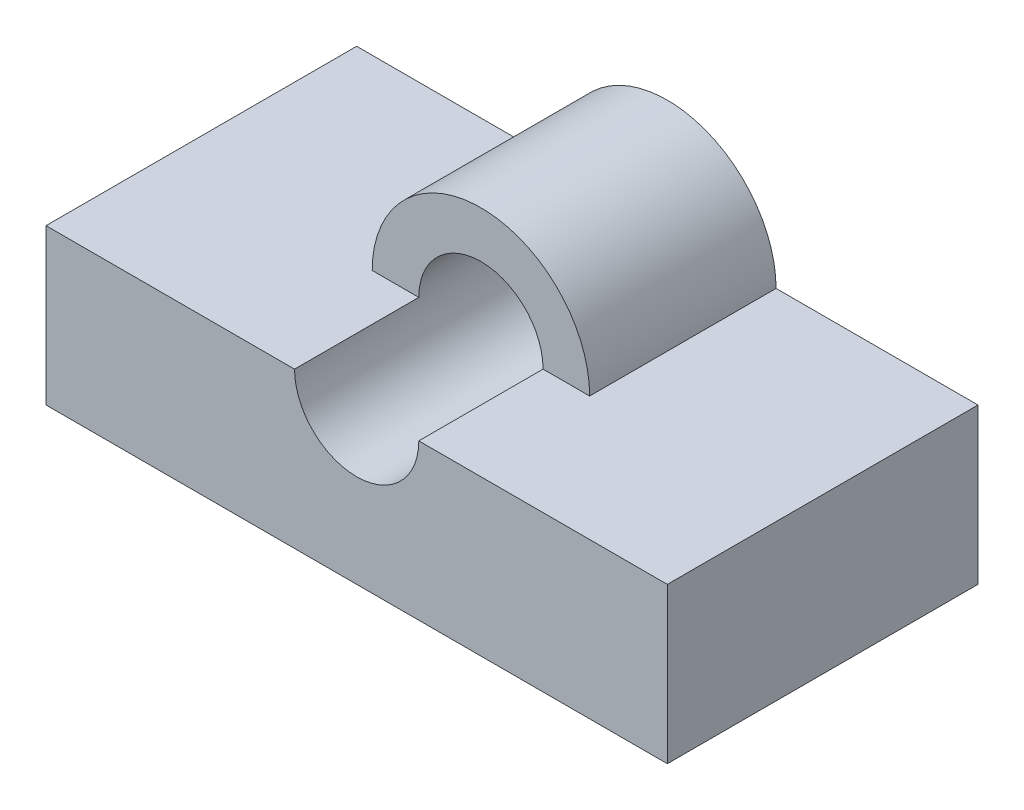
ISO-10303-21;
HEADER;
FILE_DESCRIPTION(('STEP AP214'),'2;1');
FILE_NAME('part.step','',(''),(''),'','','');
FILE_SCHEMA(('AUTOMOTIVE_DESIGN { 1 0 10303 214 1 1 1 1 }'));
ENDSEC;
DATA;
#1=APPLICATION_CONTEXT('core data for automotive mechanical design processes');
#2=APPLICATION_PROTOCOL_DEFINITION('international standard','automotive_design',2000,#1);
#3=PRODUCT_CONTEXT('',#1,'mechanical');
#4=PRODUCT('Part','Part','',(#3));
#5=PRODUCT_RELATED_PRODUCT_CATEGORY('part','',(#4));
#6=PRODUCT_DEFINITION_FORMATION('','',#4);
#7=PRODUCT_DEFINITION_CONTEXT('part definition',#1,'design');
#8=PRODUCT_DEFINITION('design','',#6,#7);
#9=PRODUCT_DEFINITION_SHAPE('','',#8);
#10=(LENGTH_UNIT() NAMED_UNIT(*) SI_UNIT(.MILLI.,.METRE.));
#11=(NAMED_UNIT(*) PLANE_ANGLE_UNIT() SI_UNIT($,.RADIAN.));
#12=(NAMED_UNIT(*) SI_UNIT($,.STERADIAN.) SOLID_ANGLE_UNIT());
#13=UNCERTAINTY_MEASURE_WITH_UNIT(LENGTH_MEASURE(1.E-05),#10,'distance_accuracy_value','');
#14=(GEOMETRIC_REPRESENTATION_CONTEXT(3) GLOBAL_UNCERTAINTY_ASSIGNED_CONTEXT((#13)) GLOBAL_UNIT_ASSIGNED_CONTEXT((#10,
#11,#12)) REPRESENTATION_CONTEXT('',''));
#15=CARTESIAN_POINT('',(0.,0.,0.));
#16=DIRECTION('',(0.,0.,1.));
#17=DIRECTION('',(1.,0.,0.));
#18=AXIS2_PLACEMENT_3D('',#15,#16,#17);
#19=CARTESIAN_POINT('',(0.,25.,50.));
#20=DIRECTION('',(0.,-1.,0.));
#21=DIRECTION('',(0.,0.,-1.));
#22=AXIS2_PLACEMENT_3D('',#19,#20,#21);
#23=PLANE('',#22);
#24=DIRECTION('',(-1.,0.,0.));
#25=VECTOR('',#24,1.);
#26=CARTESIAN_POINT('',(0.,25.,0.));
#27=LINE('',#26,#25);
#28=CARTESIAN_POINT('',(100.,25.,0.));
#29=VERTEX_POINT('',#28);
#30=CARTESIAN_POINT('',(67.5,25.,0.));
#31=VERTEX_POINT('',#30);
#32=EDGE_CURVE('E112',#29,#31,#27,.T.);
#33=ORIENTED_EDGE('',*,*,#32,.T.);
#34=DIRECTION('',(0.,0.,-1.));
#35=VECTOR('',#34,1.);
#36=CARTESIAN_POINT('',(67.5,25.,30.));
#37=LINE('',#36,#35);
#38=CARTESIAN_POINT('',(67.5,25.,30.));
#39=VERTEX_POINT('',#38);
#40=EDGE_CURVE('E49',#31,#39,#37,.F.);
#41=ORIENTED_EDGE('',*,*,#40,.T.);
#42=DIRECTION('',(1.,0.,0.));
#43=VECTOR('',#42,1.);
#44=CARTESIAN_POINT('',(0.,25.,30.));
#45=LINE('',#44,#43);
#46=CARTESIAN_POINT('',(60.,25.,30.));
#47=VERTEX_POINT('',#46);
#48=EDGE_CURVE('E53',#47,#39,#45,.T.);
#49=ORIENTED_EDGE('',*,*,#48,.F.);
#50=DIRECTION('',(0.,0.,-1.));
#51=VECTOR('',#50,1.);
#52=CARTESIAN_POINT('',(60.,25.,50.));
#53=LINE('',#52,#51);
#54=CARTESIAN_POINT('',(60.,25.,50.));
#55=VERTEX_POINT('',#54);
#56=EDGE_CURVE('E42',#55,#47,#53,.T.);
#57=ORIENTED_EDGE('',*,*,#56,.F.);
#58=DIRECTION('',(-1.,0.,0.));
#59=VECTOR('',#58,1.);
#60=CARTESIAN_POINT('',(0.,25.,50.));
#61=LINE('',#60,#59);
#62=CARTESIAN_POINT('',(100.,25.,50.));
#63=VERTEX_POINT('',#62);
#64=EDGE_CURVE('E129',#63,#55,#61,.T.);
#65=ORIENTED_EDGE('',*,*,#64,.F.);
#66=DIRECTION('',(0.,0.,-1.));
#67=VECTOR('',#66,1.);
#68=CARTESIAN_POINT('',(100.,25.,50.));
#69=LINE('',#68,#67);
#70=EDGE_CURVE('E143',#63,#29,#69,.T.);
#71=ORIENTED_EDGE('',*,*,#70,.T.);
#72=EDGE_LOOP('',(#33,#41,#49,#57,#65,#71));
#73=FACE_BOUND('',#72,.T.);
#74=ADVANCED_FACE('F34',(#73),#23,.F.);
#75=CARTESIAN_POINT('',(50.,25.,50.));
#76=DIRECTION('',(0.,0.,-1.));
#77=DIRECTION('',(-1.,0.,0.));
#78=AXIS2_PLACEMENT_3D('',#75,#76,#77);
#79=CYLINDRICAL_SURFACE('',#78,10.);
#80=ORIENTED_EDGE('',*,*,#56,.T.);
#81=CARTESIAN_POINT('',(50.,25.,30.));
#82=DIRECTION('',(0.,0.,-1.));
#83=DIRECTION('',(-1.,0.,0.));
#84=AXIS2_PLACEMENT_3D('',#81,#82,#83);
#85=CIRCLE('',#84,10.);
#86=CARTESIAN_POINT('',(40.,25.,30.));
#87=VERTEX_POINT('',#86);
#88=EDGE_CURVE('E119',#87,#47,#85,.T.);
#89=ORIENTED_EDGE('',*,*,#88,.F.);
#90=DIRECTION('',(0.,0.,-1.));
#91=VECTOR('',#90,1.);
#92=CARTESIAN_POINT('',(40.,25.,50.));
#93=LINE('',#92,#91);
#94=CARTESIAN_POINT('',(40.,25.,50.));
#95=VERTEX_POINT('',#94);
#96=EDGE_CURVE('E159',#95,#87,#93,.T.);
#97=ORIENTED_EDGE('',*,*,#96,.F.);
#98=CARTESIAN_POINT('',(50.,25.,50.));
#99=DIRECTION('',(0.,0.,-1.));
#100=DIRECTION('',(-1.,0.,0.));
#101=AXIS2_PLACEMENT_3D('',#98,#99,#100);
#102=CIRCLE('',#101,10.);
#103=EDGE_CURVE('E132',#55,#95,#102,.T.);
#104=ORIENTED_EDGE('',*,*,#103,.F.);
#105=EDGE_LOOP('',(#80,#89,#97,#104));
#106=FACE_BOUND('',#105,.T.);
#107=CARTESIAN_POINT('',(50.,25.,0.));
#108=DIRECTION('',(0.,0.,-1.));
#109=DIRECTION('',(-1.,0.,0.));
#110=AXIS2_PLACEMENT_3D('',#107,#108,#109);
#111=CIRCLE('',#110,10.);
#112=CARTESIAN_POINT('',(40.,25.,0.));
#113=VERTEX_POINT('',#112);
#114=EDGE_CURVE('E110',#113,#113,#111,.T.);
#115=ORIENTED_EDGE('',*,*,#114,.T.);
#116=EDGE_LOOP('',(#115));
#117=FACE_BOUND('',#116,.T.);
#118=ADVANCED_FACE('F36',(#106,#117),#79,.F.);
#119=DIRECTION('',(1.,0.,0.));
#120=VECTOR('',#119,1.);
#121=CARTESIAN_POINT('',(0.,25.,30.));
#122=LINE('',#121,#120);
#123=CARTESIAN_POINT('',(32.5,25.,30.));
#124=VERTEX_POINT('',#123);
#125=EDGE_CURVE('E11',#124,#87,#122,.T.);
#126=ORIENTED_EDGE('',*,*,#125,.F.);
#127=DIRECTION('',(0.,0.,-1.));
#128=VECTOR('',#127,1.);
#129=CARTESIAN_POINT('',(32.5,25.,30.));
#130=LINE('',#129,#128);
#131=CARTESIAN_POINT('',(32.5,25.,0.));
#132=VERTEX_POINT('',#131);
#133=EDGE_CURVE('E114',#124,#132,#130,.T.);
#134=ORIENTED_EDGE('',*,*,#133,.T.);
#135=CARTESIAN_POINT('',(0.,25.,0.));
#136=VERTEX_POINT('',#135);
#137=EDGE_CURVE('E98',#132,#136,#27,.T.);
#138=ORIENTED_EDGE('',*,*,#137,.T.);
#139=DIRECTION('',(0.,0.,-1.));
#140=VECTOR('',#139,1.);
#141=CARTESIAN_POINT('',(0.,25.,50.));
#142=LINE('',#141,#140);
#143=CARTESIAN_POINT('',(0.,25.,50.));
#144=VERTEX_POINT('',#143);
#145=EDGE_CURVE('E157',#144,#136,#142,.T.);
#146=ORIENTED_EDGE('',*,*,#145,.F.);
#147=EDGE_CURVE('E134',#95,#144,#61,.T.);
#148=ORIENTED_EDGE('',*,*,#147,.F.);
#149=ORIENTED_EDGE('',*,*,#96,.T.);
#150=EDGE_LOOP('',(#126,#134,#138,#146,#148,#149));
#151=FACE_BOUND('',#150,.T.);
#152=ADVANCED_FACE('F115',(#151),#23,.F.);
#153=CARTESIAN_POINT('',(0.,0.,50.));
#154=DIRECTION('',(1.,0.,0.));
#155=DIRECTION('',(0.,0.,-1.));
#156=AXIS2_PLACEMENT_3D('',#153,#154,#155);
#157=PLANE('',#156);
#158=DIRECTION('',(0.,-1.,0.));
#159=VECTOR('',#158,1.);
#160=CARTESIAN_POINT('',(0.,0.,0.));
#161=LINE('',#160,#159);
#162=CARTESIAN_POINT('',(0.,0.,0.));
#163=VERTEX_POINT('',#162);
#164=EDGE_CURVE('E106',#136,#163,#161,.T.);
#165=ORIENTED_EDGE('',*,*,#164,.T.);
#166=DIRECTION('',(0.,0.,-1.));
#167=VECTOR('',#166,1.);
#168=CARTESIAN_POINT('',(0.,0.,50.));
#169=LINE('',#168,#167);
#170=CARTESIAN_POINT('',(0.,0.,50.));
#171=VERTEX_POINT('',#170);
#172=EDGE_CURVE('E155',#171,#163,#169,.T.);
#173=ORIENTED_EDGE('',*,*,#172,.F.);
#174=DIRECTION('',(0.,-1.,0.));
#175=VECTOR('',#174,1.);
#176=CARTESIAN_POINT('',(0.,0.,50.));
#177=LINE('',#176,#175);
#178=EDGE_CURVE('E136',#144,#171,#177,.T.);
#179=ORIENTED_EDGE('',*,*,#178,.F.);
#180=ORIENTED_EDGE('',*,*,#145,.T.);
#181=EDGE_LOOP('',(#165,#173,#179,#180));
#182=FACE_BOUND('',#181,.T.);
#183=ADVANCED_FACE('F184',(#182),#157,.F.);
#184=CARTESIAN_POINT('',(0.,0.,50.));
#185=DIRECTION('',(0.,-1.,0.));
#186=DIRECTION('',(0.,0.,-1.));
#187=AXIS2_PLACEMENT_3D('',#184,#185,#186);
#188=PLANE('',#187);
#189=DIRECTION('',(-1.,0.,0.));
#190=VECTOR('',#189,1.);
#191=CARTESIAN_POINT('',(0.,0.,0.));
#192=LINE('',#191,#190);
#193=CARTESIAN_POINT('',(100.,0.,0.));
#194=VERTEX_POINT('',#193);
#195=EDGE_CURVE('E148',#194,#163,#192,.T.);
#196=ORIENTED_EDGE('',*,*,#195,.F.);
#197=DIRECTION('',(0.,0.,-1.));
#198=VECTOR('',#197,1.);
#199=CARTESIAN_POINT('',(100.,0.,50.));
#200=LINE('',#199,#198);
#201=CARTESIAN_POINT('',(100.,0.,50.));
#202=VERTEX_POINT('',#201);
#203=EDGE_CURVE('E153',#202,#194,#200,.T.);
#204=ORIENTED_EDGE('',*,*,#203,.F.);
#205=DIRECTION('',(-1.,0.,0.));
#206=VECTOR('',#205,1.);
#207=CARTESIAN_POINT('',(0.,0.,50.));
#208=LINE('',#207,#206);
#209=EDGE_CURVE('E138',#202,#171,#208,.T.);
#210=ORIENTED_EDGE('',*,*,#209,.T.);
#211=ORIENTED_EDGE('',*,*,#172,.T.);
#212=EDGE_LOOP('',(#196,#204,#210,#211));
#213=FACE_BOUND('',#212,.T.);
#214=ADVANCED_FACE('F188',(#213),#188,.T.);
#215=CARTESIAN_POINT('',(100.,0.,50.));
#216=DIRECTION('',(1.,0.,0.));
#217=DIRECTION('',(0.,0.,-1.));
#218=AXIS2_PLACEMENT_3D('',#215,#216,#217);
#219=PLANE('',#218);
#220=DIRECTION('',(0.,-1.,0.));
#221=VECTOR('',#220,1.);
#222=CARTESIAN_POINT('',(100.,0.,0.));
#223=LINE('',#222,#221);
#224=EDGE_CURVE('E133',#29,#194,#223,.T.);
#225=ORIENTED_EDGE('',*,*,#224,.F.);
#226=ORIENTED_EDGE('',*,*,#70,.F.);
#227=DIRECTION('',(0.,-1.,0.));
#228=VECTOR('',#227,1.);
#229=CARTESIAN_POINT('',(100.,0.,50.));
#230=LINE('',#229,#228);
#231=EDGE_CURVE('E141',#63,#202,#230,.T.);
#232=ORIENTED_EDGE('',*,*,#231,.T.);
#233=ORIENTED_EDGE('',*,*,#203,.T.);
#234=EDGE_LOOP('',(#225,#226,#232,#233));
#235=FACE_BOUND('',#234,.T.);
#236=ADVANCED_FACE('F193',(#235),#219,.T.);
#237=CARTESIAN_POINT('',(0.,0.,50.));
#238=DIRECTION('',(0.,0.,-1.));
#239=DIRECTION('',(-1.,0.,0.));
#240=AXIS2_PLACEMENT_3D('',#237,#238,#239);
#241=PLANE('',#240);
#242=ORIENTED_EDGE('',*,*,#64,.T.);
#243=ORIENTED_EDGE('',*,*,#103,.T.);
#244=ORIENTED_EDGE('',*,*,#147,.T.);
#245=ORIENTED_EDGE('',*,*,#178,.T.);
#246=ORIENTED_EDGE('',*,*,#209,.F.);
#247=ORIENTED_EDGE('',*,*,#231,.F.);
#248=EDGE_LOOP('',(#242,#243,#244,#245,#246,#247));
#249=FACE_BOUND('',#248,.T.);
#250=ADVANCED_FACE('F175',(#249),#241,.F.);
#251=CARTESIAN_POINT('',(0.,0.,0.));
#252=DIRECTION('',(0.,0.,-1.));
#253=DIRECTION('',(-1.,0.,0.));
#254=AXIS2_PLACEMENT_3D('',#251,#252,#253);
#255=PLANE('',#254);
#256=ORIENTED_EDGE('',*,*,#114,.F.);
#257=EDGE_LOOP('',(#256));
#258=FACE_BOUND('',#257,.T.);
#259=ORIENTED_EDGE('',*,*,#137,.F.);
#260=CARTESIAN_POINT('',(50.,25.,0.));
#261=DIRECTION('',(0.,0.,-1.));
#262=DIRECTION('',(-1.,0.,0.));
#263=AXIS2_PLACEMENT_3D('',#260,#261,#262);
#264=CIRCLE('',#263,17.5);
#265=EDGE_CURVE('E103',#132,#31,#264,.T.);
#266=ORIENTED_EDGE('',*,*,#265,.T.);
#267=ORIENTED_EDGE('',*,*,#32,.F.);
#268=ORIENTED_EDGE('',*,*,#224,.T.);
#269=ORIENTED_EDGE('',*,*,#195,.T.);
#270=ORIENTED_EDGE('',*,*,#164,.F.);
#271=EDGE_LOOP('',(#259,#266,#267,#268,#269,#270));
#272=FACE_BOUND('',#271,.T.);
#273=ADVANCED_FACE('F100',(#258,#272),#255,.T.);
#274=CARTESIAN_POINT('',(0.,0.,30.));
#275=DIRECTION('',(0.,0.,-1.));
#276=DIRECTION('',(-1.,0.,0.));
#277=AXIS2_PLACEMENT_3D('',#274,#275,#276);
#278=PLANE('',#277);
#279=ORIENTED_EDGE('',*,*,#88,.T.);
#280=ORIENTED_EDGE('',*,*,#48,.T.);
#281=CARTESIAN_POINT('',(50.,25.,30.));
#282=DIRECTION('',(0.,0.,-1.));
#283=DIRECTION('',(-1.,0.,0.));
#284=AXIS2_PLACEMENT_3D('',#281,#282,#283);
#285=CIRCLE('',#284,17.5);
#286=EDGE_CURVE('E122',#124,#39,#285,.T.);
#287=ORIENTED_EDGE('',*,*,#286,.F.);
#288=ORIENTED_EDGE('',*,*,#125,.T.);
#289=EDGE_LOOP('',(#279,#280,#287,#288));
#290=FACE_BOUND('',#289,.T.);
#291=ADVANCED_FACE('F167',(#290),#278,.F.);
#292=CARTESIAN_POINT('',(50.,25.,30.));
#293=DIRECTION('',(0.,0.,-1.));
#294=DIRECTION('',(-1.,0.,0.));
#295=AXIS2_PLACEMENT_3D('',#292,#293,#294);
#296=CYLINDRICAL_SURFACE('',#295,17.5);
#297=ORIENTED_EDGE('',*,*,#40,.F.);
#298=ORIENTED_EDGE('',*,*,#265,.F.);
#299=ORIENTED_EDGE('',*,*,#133,.F.);
#300=ORIENTED_EDGE('',*,*,#286,.T.);
#301=EDGE_LOOP('',(#297,#298,#299,#300));
#302=FACE_BOUND('',#301,.T.);
#303=ADVANCED_FACE('F121',(#302),#296,.T.);
#304=CLOSED_SHELL('',(#74,#118,#152,#183,#214,#236,#250,#273,#291,#303));
#305=MANIFOLD_SOLID_BREP('B2',#304);
#306=ADVANCED_BREP_SHAPE_REPRESENTATION('',(#18,#305),#14);
#307=SHAPE_DEFINITION_REPRESENTATION(#9,#306);
ENDSEC;
END-ISO-10303-21;
